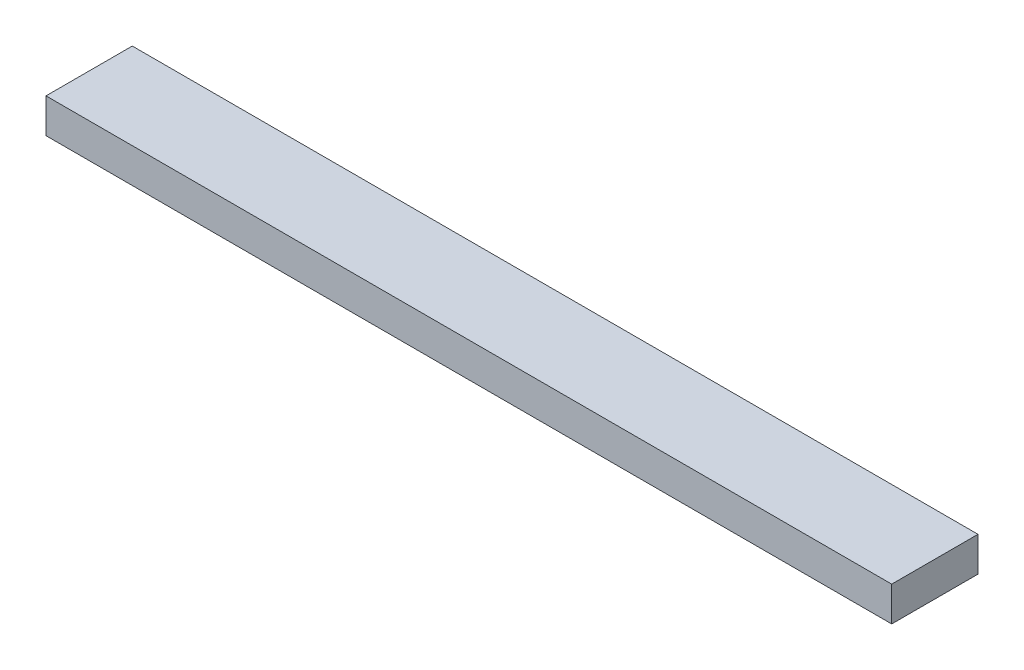
ISO-10303-21;
HEADER;
FILE_DESCRIPTION(('STEP AP214'),'2;1');
FILE_NAME('part.step','',(''),(''),'','','');
FILE_SCHEMA(('AUTOMOTIVE_DESIGN { 1 0 10303 214 1 1 1 1 }'));
ENDSEC;
DATA;
#1=APPLICATION_CONTEXT('core data for automotive mechanical design processes');
#2=APPLICATION_PROTOCOL_DEFINITION('international standard','automotive_design',2000,#1);
#3=PRODUCT_CONTEXT('',#1,'mechanical');
#4=PRODUCT('Part','Part','',(#3));
#5=PRODUCT_RELATED_PRODUCT_CATEGORY('part','',(#4));
#6=PRODUCT_DEFINITION_FORMATION('','',#4);
#7=PRODUCT_DEFINITION_CONTEXT('part definition',#1,'design');
#8=PRODUCT_DEFINITION('design','',#6,#7);
#9=PRODUCT_DEFINITION_SHAPE('','',#8);
#10=(LENGTH_UNIT() NAMED_UNIT(*) SI_UNIT(.MILLI.,.METRE.));
#11=(NAMED_UNIT(*) PLANE_ANGLE_UNIT() SI_UNIT($,.RADIAN.));
#12=(NAMED_UNIT(*) SI_UNIT($,.STERADIAN.) SOLID_ANGLE_UNIT());
#13=UNCERTAINTY_MEASURE_WITH_UNIT(LENGTH_MEASURE(1.E-05),#10,'distance_accuracy_value','');
#14=(GEOMETRIC_REPRESENTATION_CONTEXT(3) GLOBAL_UNCERTAINTY_ASSIGNED_CONTEXT((#13)) GLOBAL_UNIT_ASSIGNED_CONTEXT((#10,
#11,#12)) REPRESENTATION_CONTEXT('',''));
#15=CARTESIAN_POINT('',(0.,0.,0.));
#16=DIRECTION('',(0.,0.,1.));
#17=DIRECTION('',(1.,0.,0.));
#18=AXIS2_PLACEMENT_3D('',#15,#16,#17);
#19=CARTESIAN_POINT('',(0.,4.,0.));
#20=DIRECTION('',(1.,0.,0.));
#21=DIRECTION('',(0.,0.,-1.));
#22=AXIS2_PLACEMENT_3D('',#19,#20,#21);
#23=PLANE('',#22);
#24=DIRECTION('',(0.,0.,1.));
#25=VECTOR('',#24,1.);
#26=CARTESIAN_POINT('',(0.,0.,0.));
#27=LINE('',#26,#25);
#28=CARTESIAN_POINT('',(0.,0.,-10.));
#29=VERTEX_POINT('',#28);
#30=CARTESIAN_POINT('',(0.,0.,0.));
#31=VERTEX_POINT('',#30);
#32=EDGE_CURVE('E96',#29,#31,#27,.T.);
#33=ORIENTED_EDGE('',*,*,#32,.T.);
#34=DIRECTION('',(0.,-1.,0.));
#35=VECTOR('',#34,1.);
#36=CARTESIAN_POINT('',(0.,4.,0.));
#37=LINE('',#36,#35);
#38=CARTESIAN_POINT('',(0.,4.,0.));
#39=VERTEX_POINT('',#38);
#40=EDGE_CURVE('E11',#39,#31,#37,.T.);
#41=ORIENTED_EDGE('',*,*,#40,.F.);
#42=DIRECTION('',(0.,0.,1.));
#43=VECTOR('',#42,1.);
#44=CARTESIAN_POINT('',(0.,4.,0.));
#45=LINE('',#44,#43);
#46=CARTESIAN_POINT('',(0.,4.,-10.));
#47=VERTEX_POINT('',#46);
#48=EDGE_CURVE('E84',#47,#39,#45,.T.);
#49=ORIENTED_EDGE('',*,*,#48,.F.);
#50=DIRECTION('',(0.,-1.,0.));
#51=VECTOR('',#50,1.);
#52=CARTESIAN_POINT('',(0.,4.,-10.));
#53=LINE('',#52,#51);
#54=EDGE_CURVE('E92',#47,#29,#53,.T.);
#55=ORIENTED_EDGE('',*,*,#54,.T.);
#56=EDGE_LOOP('',(#33,#41,#49,#55));
#57=FACE_BOUND('',#56,.T.);
#58=ADVANCED_FACE('F33',(#57),#23,.F.);
#59=CARTESIAN_POINT('',(0.,4.,0.));
#60=DIRECTION('',(0.,0.,-1.));
#61=DIRECTION('',(-1.,0.,0.));
#62=AXIS2_PLACEMENT_3D('',#59,#60,#61);
#63=PLANE('',#62);
#64=DIRECTION('',(1.,0.,0.));
#65=VECTOR('',#64,1.);
#66=CARTESIAN_POINT('',(0.,0.,0.));
#67=LINE('',#66,#65);
#68=CARTESIAN_POINT('',(98.,0.,0.));
#69=VERTEX_POINT('',#68);
#70=EDGE_CURVE('E88',#31,#69,#67,.T.);
#71=ORIENTED_EDGE('',*,*,#70,.T.);
#72=DIRECTION('',(0.,-1.,0.));
#73=VECTOR('',#72,1.);
#74=CARTESIAN_POINT('',(98.,4.,0.));
#75=LINE('',#74,#73);
#76=CARTESIAN_POINT('',(98.,4.,0.));
#77=VERTEX_POINT('',#76);
#78=EDGE_CURVE('E41',#77,#69,#75,.T.);
#79=ORIENTED_EDGE('',*,*,#78,.F.);
#80=DIRECTION('',(1.,0.,0.));
#81=VECTOR('',#80,1.);
#82=CARTESIAN_POINT('',(0.,4.,0.));
#83=LINE('',#82,#81);
#84=EDGE_CURVE('E79',#39,#77,#83,.T.);
#85=ORIENTED_EDGE('',*,*,#84,.F.);
#86=ORIENTED_EDGE('',*,*,#40,.T.);
#87=EDGE_LOOP('',(#71,#79,#85,#86));
#88=FACE_BOUND('',#87,.T.);
#89=ADVANCED_FACE('F87',(#88),#63,.F.);
#90=CARTESIAN_POINT('',(98.,4.,0.));
#91=DIRECTION('',(-1.,0.,0.));
#92=DIRECTION('',(0.,0.,1.));
#93=AXIS2_PLACEMENT_3D('',#90,#91,#92);
#94=PLANE('',#93);
#95=DIRECTION('',(0.,0.,-1.));
#96=VECTOR('',#95,1.);
#97=CARTESIAN_POINT('',(98.,0.,0.));
#98=LINE('',#97,#96);
#99=CARTESIAN_POINT('',(98.,0.,-10.));
#100=VERTEX_POINT('',#99);
#101=EDGE_CURVE('E66',#69,#100,#98,.T.);
#102=ORIENTED_EDGE('',*,*,#101,.T.);
#103=DIRECTION('',(0.,-1.,0.));
#104=VECTOR('',#103,1.);
#105=CARTESIAN_POINT('',(98.,4.,-10.));
#106=LINE('',#105,#104);
#107=CARTESIAN_POINT('',(98.,4.,-10.));
#108=VERTEX_POINT('',#107);
#109=EDGE_CURVE('E89',#108,#100,#106,.T.);
#110=ORIENTED_EDGE('',*,*,#109,.F.);
#111=DIRECTION('',(0.,0.,-1.));
#112=VECTOR('',#111,1.);
#113=CARTESIAN_POINT('',(98.,4.,0.));
#114=LINE('',#113,#112);
#115=EDGE_CURVE('E82',#77,#108,#114,.T.);
#116=ORIENTED_EDGE('',*,*,#115,.F.);
#117=ORIENTED_EDGE('',*,*,#78,.T.);
#118=EDGE_LOOP('',(#102,#110,#116,#117));
#119=FACE_BOUND('',#118,.T.);
#120=ADVANCED_FACE('F90',(#119),#94,.F.);
#121=CARTESIAN_POINT('',(0.,4.,-10.));
#122=DIRECTION('',(0.,0.,1.));
#123=DIRECTION('',(1.,0.,0.));
#124=AXIS2_PLACEMENT_3D('',#121,#122,#123);
#125=PLANE('',#124);
#126=DIRECTION('',(-1.,0.,0.));
#127=VECTOR('',#126,1.);
#128=CARTESIAN_POINT('',(0.,0.,-10.));
#129=LINE('',#128,#127);
#130=EDGE_CURVE('E72',#100,#29,#129,.T.);
#131=ORIENTED_EDGE('',*,*,#130,.T.);
#132=ORIENTED_EDGE('',*,*,#54,.F.);
#133=DIRECTION('',(-1.,0.,0.));
#134=VECTOR('',#133,1.);
#135=CARTESIAN_POINT('',(0.,4.,-10.));
#136=LINE('',#135,#134);
#137=EDGE_CURVE('E49',#108,#47,#136,.T.);
#138=ORIENTED_EDGE('',*,*,#137,.F.);
#139=ORIENTED_EDGE('',*,*,#109,.T.);
#140=EDGE_LOOP('',(#131,#132,#138,#139));
#141=FACE_BOUND('',#140,.T.);
#142=ADVANCED_FACE('F103',(#141),#125,.F.);
#143=CARTESIAN_POINT('',(0.,4.,0.));
#144=DIRECTION('',(0.,-1.,0.));
#145=DIRECTION('',(0.,0.,-1.));
#146=AXIS2_PLACEMENT_3D('',#143,#144,#145);
#147=PLANE('',#146);
#148=ORIENTED_EDGE('',*,*,#48,.T.);
#149=ORIENTED_EDGE('',*,*,#84,.T.);
#150=ORIENTED_EDGE('',*,*,#115,.T.);
#151=ORIENTED_EDGE('',*,*,#137,.T.);
#152=EDGE_LOOP('',(#148,#149,#150,#151));
#153=FACE_BOUND('',#152,.T.);
#154=ADVANCED_FACE('F80',(#153),#147,.F.);
#155=CARTESIAN_POINT('',(0.,0.,0.));
#156=DIRECTION('',(0.,-1.,0.));
#157=DIRECTION('',(0.,0.,-1.));
#158=AXIS2_PLACEMENT_3D('',#155,#156,#157);
#159=PLANE('',#158);
#160=ORIENTED_EDGE('',*,*,#32,.F.);
#161=ORIENTED_EDGE('',*,*,#130,.F.);
#162=ORIENTED_EDGE('',*,*,#101,.F.);
#163=ORIENTED_EDGE('',*,*,#70,.F.);
#164=EDGE_LOOP('',(#160,#161,#162,#163));
#165=FACE_BOUND('',#164,.T.);
#166=ADVANCED_FACE('F106',(#165),#159,.T.);
#167=CLOSED_SHELL('',(#58,#89,#120,#142,#154,#166));
#168=MANIFOLD_SOLID_BREP('B2',#167);
#169=ADVANCED_BREP_SHAPE_REPRESENTATION('',(#18,#168),#14);
#170=SHAPE_DEFINITION_REPRESENTATION(#9,#169);
ENDSEC;
END-ISO-10303-21;
